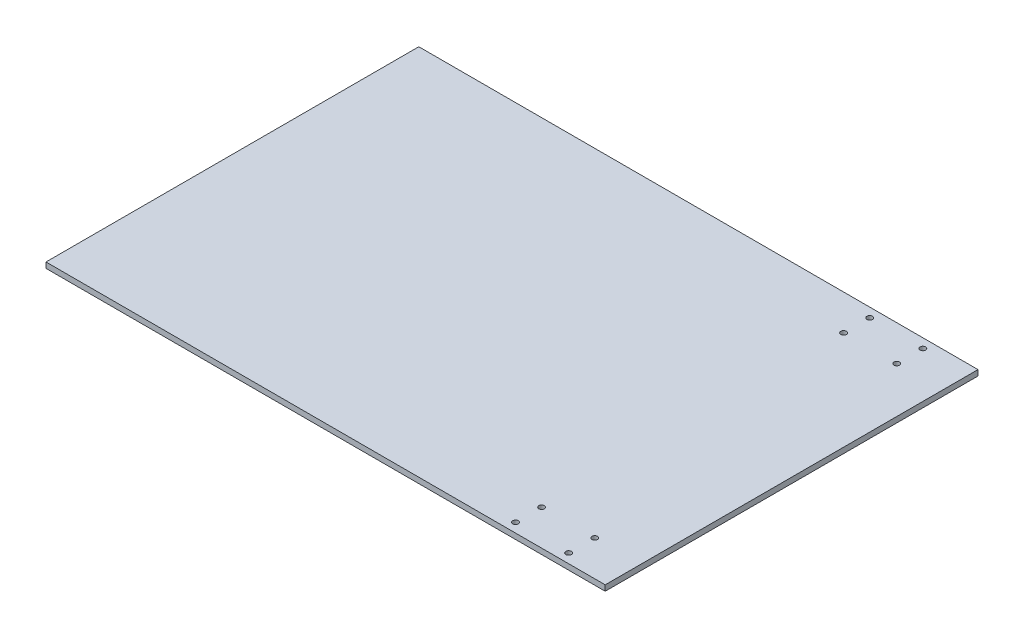
ISO-10303-21;
HEADER;
FILE_DESCRIPTION(('STEP AP214'),'2;1');
FILE_NAME('part.step','',(''),(''),'','','');
FILE_SCHEMA(('AUTOMOTIVE_DESIGN { 1 0 10303 214 1 1 1 1 }'));
ENDSEC;
DATA;
#1=APPLICATION_CONTEXT('core data for automotive mechanical design processes');
#2=APPLICATION_PROTOCOL_DEFINITION('international standard','automotive_design',2000,#1);
#3=PRODUCT_CONTEXT('',#1,'mechanical');
#4=PRODUCT('Part','Part','',(#3));
#5=PRODUCT_RELATED_PRODUCT_CATEGORY('part','',(#4));
#6=PRODUCT_DEFINITION_FORMATION('','',#4);
#7=PRODUCT_DEFINITION_CONTEXT('part definition',#1,'design');
#8=PRODUCT_DEFINITION('design','',#6,#7);
#9=PRODUCT_DEFINITION_SHAPE('','',#8);
#10=(LENGTH_UNIT() NAMED_UNIT(*) SI_UNIT(.MILLI.,.METRE.));
#11=(NAMED_UNIT(*) PLANE_ANGLE_UNIT() SI_UNIT($,.RADIAN.));
#12=(NAMED_UNIT(*) SI_UNIT($,.STERADIAN.) SOLID_ANGLE_UNIT());
#13=UNCERTAINTY_MEASURE_WITH_UNIT(LENGTH_MEASURE(1.E-05),#10,'distance_accuracy_value','');
#14=(GEOMETRIC_REPRESENTATION_CONTEXT(3) GLOBAL_UNCERTAINTY_ASSIGNED_CONTEXT((#13)) GLOBAL_UNIT_ASSIGNED_CONTEXT((#10,
#11,#12)) REPRESENTATION_CONTEXT('',''));
#15=CARTESIAN_POINT('',(0.,0.,0.));
#16=DIRECTION('',(0.,0.,1.));
#17=DIRECTION('',(1.,0.,0.));
#18=AXIS2_PLACEMENT_3D('',#15,#16,#17);
#19=CARTESIAN_POINT('',(0.,3.,0.));
#20=DIRECTION('',(1.,0.,0.));
#21=DIRECTION('',(0.,0.,-1.));
#22=AXIS2_PLACEMENT_3D('',#19,#20,#21);
#23=PLANE('',#22);
#24=DIRECTION('',(0.,0.,1.));
#25=VECTOR('',#24,1.);
#26=CARTESIAN_POINT('',(0.,0.,0.));
#27=LINE('',#26,#25);
#28=CARTESIAN_POINT('',(0.,0.,-200.));
#29=VERTEX_POINT('',#28);
#30=CARTESIAN_POINT('',(0.,0.,0.));
#31=VERTEX_POINT('',#30);
#32=EDGE_CURVE('E106',#29,#31,#27,.T.);
#33=ORIENTED_EDGE('',*,*,#32,.T.);
#34=DIRECTION('',(0.,-1.,0.));
#35=VECTOR('',#34,1.);
#36=CARTESIAN_POINT('',(0.,3.,0.));
#37=LINE('',#36,#35);
#38=CARTESIAN_POINT('',(0.,3.,0.));
#39=VERTEX_POINT('',#38);
#40=EDGE_CURVE('E11',#39,#31,#37,.T.);
#41=ORIENTED_EDGE('',*,*,#40,.F.);
#42=DIRECTION('',(0.,0.,1.));
#43=VECTOR('',#42,1.);
#44=CARTESIAN_POINT('',(0.,3.,0.));
#45=LINE('',#44,#43);
#46=CARTESIAN_POINT('',(0.,3.,-200.));
#47=VERTEX_POINT('',#46);
#48=EDGE_CURVE('E90',#47,#39,#45,.T.);
#49=ORIENTED_EDGE('',*,*,#48,.F.);
#50=DIRECTION('',(0.,-1.,0.));
#51=VECTOR('',#50,1.);
#52=CARTESIAN_POINT('',(0.,3.,-200.));
#53=LINE('',#52,#51);
#54=EDGE_CURVE('E102',#47,#29,#53,.T.);
#55=ORIENTED_EDGE('',*,*,#54,.T.);
#56=EDGE_LOOP('',(#33,#41,#49,#55));
#57=FACE_BOUND('',#56,.T.);
#58=ADVANCED_FACE('F38',(#57),#23,.F.);
#59=CARTESIAN_POINT('',(0.,3.,0.));
#60=DIRECTION('',(0.,0.,-1.));
#61=DIRECTION('',(-1.,0.,0.));
#62=AXIS2_PLACEMENT_3D('',#59,#60,#61);
#63=PLANE('',#62);
#64=DIRECTION('',(1.,0.,0.));
#65=VECTOR('',#64,1.);
#66=CARTESIAN_POINT('',(0.,0.,0.));
#67=LINE('',#66,#65);
#68=CARTESIAN_POINT('',(300.,0.,0.));
#69=VERTEX_POINT('',#68);
#70=EDGE_CURVE('E95',#31,#69,#67,.T.);
#71=ORIENTED_EDGE('',*,*,#70,.T.);
#72=DIRECTION('',(0.,-1.,0.));
#73=VECTOR('',#72,1.);
#74=CARTESIAN_POINT('',(300.,3.,0.));
#75=LINE('',#74,#73);
#76=CARTESIAN_POINT('',(300.,3.,0.));
#77=VERTEX_POINT('',#76);
#78=EDGE_CURVE('E47',#77,#69,#75,.T.);
#79=ORIENTED_EDGE('',*,*,#78,.F.);
#80=DIRECTION('',(1.,0.,0.));
#81=VECTOR('',#80,1.);
#82=CARTESIAN_POINT('',(0.,3.,0.));
#83=LINE('',#82,#81);
#84=EDGE_CURVE('E85',#39,#77,#83,.T.);
#85=ORIENTED_EDGE('',*,*,#84,.F.);
#86=ORIENTED_EDGE('',*,*,#40,.T.);
#87=EDGE_LOOP('',(#71,#79,#85,#86));
#88=FACE_BOUND('',#87,.T.);
#89=ADVANCED_FACE('F94',(#88),#63,.F.);
#90=CARTESIAN_POINT('',(300.,3.,0.));
#91=DIRECTION('',(-1.,0.,0.));
#92=DIRECTION('',(0.,0.,1.));
#93=AXIS2_PLACEMENT_3D('',#90,#91,#92);
#94=PLANE('',#93);
#95=DIRECTION('',(0.,0.,-1.));
#96=VECTOR('',#95,1.);
#97=CARTESIAN_POINT('',(300.,0.,0.));
#98=LINE('',#97,#96);
#99=CARTESIAN_POINT('',(300.,0.,-200.));
#100=VERTEX_POINT('',#99);
#101=EDGE_CURVE('E72',#69,#100,#98,.T.);
#102=ORIENTED_EDGE('',*,*,#101,.T.);
#103=DIRECTION('',(0.,-1.,0.));
#104=VECTOR('',#103,1.);
#105=CARTESIAN_POINT('',(300.,3.,-200.));
#106=LINE('',#105,#104);
#107=CARTESIAN_POINT('',(300.,3.,-200.));
#108=VERTEX_POINT('',#107);
#109=EDGE_CURVE('E97',#108,#100,#106,.T.);
#110=ORIENTED_EDGE('',*,*,#109,.F.);
#111=DIRECTION('',(0.,0.,-1.));
#112=VECTOR('',#111,1.);
#113=CARTESIAN_POINT('',(300.,3.,0.));
#114=LINE('',#113,#112);
#115=EDGE_CURVE('E88',#77,#108,#114,.T.);
#116=ORIENTED_EDGE('',*,*,#115,.F.);
#117=ORIENTED_EDGE('',*,*,#78,.T.);
#118=EDGE_LOOP('',(#102,#110,#116,#117));
#119=FACE_BOUND('',#118,.T.);
#120=ADVANCED_FACE('F98',(#119),#94,.F.);
#121=CARTESIAN_POINT('',(0.,3.,-200.));
#122=DIRECTION('',(0.,0.,1.));
#123=DIRECTION('',(1.,0.,0.));
#124=AXIS2_PLACEMENT_3D('',#121,#122,#123);
#125=PLANE('',#124);
#126=DIRECTION('',(-1.,0.,0.));
#127=VECTOR('',#126,1.);
#128=CARTESIAN_POINT('',(0.,0.,-200.));
#129=LINE('',#128,#127);
#130=EDGE_CURVE('E78',#100,#29,#129,.T.);
#131=ORIENTED_EDGE('',*,*,#130,.T.);
#132=ORIENTED_EDGE('',*,*,#54,.F.);
#133=DIRECTION('',(-1.,0.,0.));
#134=VECTOR('',#133,1.);
#135=CARTESIAN_POINT('',(0.,3.,-200.));
#136=LINE('',#135,#134);
#137=EDGE_CURVE('E55',#108,#47,#136,.T.);
#138=ORIENTED_EDGE('',*,*,#137,.F.);
#139=ORIENTED_EDGE('',*,*,#109,.T.);
#140=EDGE_LOOP('',(#131,#132,#138,#139));
#141=FACE_BOUND('',#140,.T.);
#142=ADVANCED_FACE('F120',(#141),#125,.F.);
#143=CARTESIAN_POINT('',(0.,3.,0.));
#144=DIRECTION('',(0.,-1.,0.));
#145=DIRECTION('',(0.,0.,-1.));
#146=AXIS2_PLACEMENT_3D('',#143,#144,#145);
#147=PLANE('',#146);
#148=CARTESIAN_POINT('',(275.4,3.,-19.));
#149=DIRECTION('',(0.,1.,0.));
#150=DIRECTION('',(0.,0.,-1.));
#151=AXIS2_PLACEMENT_3D('',#148,#149,#150);
#152=CIRCLE('',#151,1.50000000000002);
#153=CARTESIAN_POINT('',(275.4,3.,-20.5));
#154=VERTEX_POINT('',#153);
#155=EDGE_CURVE('E151',#154,#154,#152,.T.);
#156=ORIENTED_EDGE('',*,*,#155,.F.);
#157=EDGE_LOOP('',(#156));
#158=FACE_BOUND('',#157,.T.);
#159=CARTESIAN_POINT('',(275.4,3.,-195.));
#160=DIRECTION('',(0.,1.,0.));
#161=DIRECTION('',(0.,0.,-1.));
#162=AXIS2_PLACEMENT_3D('',#159,#160,#161);
#163=CIRCLE('',#162,1.50000000000002);
#164=CARTESIAN_POINT('',(275.4,3.,-196.5));
#165=VERTEX_POINT('',#164);
#166=EDGE_CURVE('E160',#165,#165,#163,.T.);
#167=ORIENTED_EDGE('',*,*,#166,.F.);
#168=EDGE_LOOP('',(#167));
#169=FACE_BOUND('',#168,.T.);
#170=CARTESIAN_POINT('',(246.9,3.,-181.));
#171=DIRECTION('',(0.,1.,0.));
#172=DIRECTION('',(0.,0.,1.));
#173=AXIS2_PLACEMENT_3D('',#170,#171,#172);
#174=CIRCLE('',#173,1.50000000000002);
#175=CARTESIAN_POINT('',(246.9,3.,-179.5));
#176=VERTEX_POINT('',#175);
#177=EDGE_CURVE('E135',#176,#176,#174,.T.);
#178=ORIENTED_EDGE('',*,*,#177,.F.);
#179=EDGE_LOOP('',(#178));
#180=FACE_BOUND('',#179,.T.);
#181=CARTESIAN_POINT('',(275.4,3.,-181.));
#182=DIRECTION('',(0.,1.,0.));
#183=DIRECTION('',(0.,0.,1.));
#184=AXIS2_PLACEMENT_3D('',#181,#182,#183);
#185=CIRCLE('',#184,1.50000000000002);
#186=CARTESIAN_POINT('',(275.4,3.,-179.5));
#187=VERTEX_POINT('',#186);
#188=EDGE_CURVE('E144',#187,#187,#185,.T.);
#189=ORIENTED_EDGE('',*,*,#188,.F.);
#190=EDGE_LOOP('',(#189));
#191=FACE_BOUND('',#190,.T.);
#192=CARTESIAN_POINT('',(275.4,3.,-5.));
#193=DIRECTION('',(0.,1.,0.));
#194=DIRECTION('',(0.,0.,1.));
#195=AXIS2_PLACEMENT_3D('',#192,#193,#194);
#196=CIRCLE('',#195,1.50000000000002);
#197=CARTESIAN_POINT('',(275.4,3.,-3.49999999999998));
#198=VERTEX_POINT('',#197);
#199=EDGE_CURVE('E183',#198,#198,#196,.T.);
#200=ORIENTED_EDGE('',*,*,#199,.F.);
#201=EDGE_LOOP('',(#200));
#202=FACE_BOUND('',#201,.T.);
#203=CARTESIAN_POINT('',(246.9,3.,-5.));
#204=DIRECTION('',(0.,1.,0.));
#205=DIRECTION('',(0.,0.,-1.));
#206=AXIS2_PLACEMENT_3D('',#203,#204,#205);
#207=CIRCLE('',#206,1.50000000000002);
#208=CARTESIAN_POINT('',(246.9,3.,-6.50000000000003));
#209=VERTEX_POINT('',#208);
#210=EDGE_CURVE('E175',#209,#209,#207,.T.);
#211=ORIENTED_EDGE('',*,*,#210,.F.);
#212=EDGE_LOOP('',(#211));
#213=FACE_BOUND('',#212,.T.);
#214=CARTESIAN_POINT('',(246.9,3.,-19.));
#215=DIRECTION('',(0.,1.,0.));
#216=DIRECTION('',(0.,0.,-1.));
#217=AXIS2_PLACEMENT_3D('',#214,#215,#216);
#218=CIRCLE('',#217,1.50000000000002);
#219=CARTESIAN_POINT('',(246.9,3.,-20.5));
#220=VERTEX_POINT('',#219);
#221=EDGE_CURVE('E167',#220,#220,#218,.T.);
#222=ORIENTED_EDGE('',*,*,#221,.F.);
#223=EDGE_LOOP('',(#222));
#224=FACE_BOUND('',#223,.T.);
#225=CARTESIAN_POINT('',(246.9,3.,-195.));
#226=DIRECTION('',(0.,1.,0.));
#227=DIRECTION('',(0.,0.,1.));
#228=AXIS2_PLACEMENT_3D('',#225,#226,#227);
#229=CIRCLE('',#228,1.50000000000002);
#230=CARTESIAN_POINT('',(246.9,3.,-193.5));
#231=VERTEX_POINT('',#230);
#232=EDGE_CURVE('E127',#231,#231,#229,.T.);
#233=ORIENTED_EDGE('',*,*,#232,.F.);
#234=EDGE_LOOP('',(#233));
#235=FACE_BOUND('',#234,.T.);
#236=ORIENTED_EDGE('',*,*,#48,.T.);
#237=ORIENTED_EDGE('',*,*,#84,.T.);
#238=ORIENTED_EDGE('',*,*,#115,.T.);
#239=ORIENTED_EDGE('',*,*,#137,.T.);
#240=EDGE_LOOP('',(#236,#237,#238,#239));
#241=FACE_BOUND('',#240,.T.);
#242=ADVANCED_FACE('F86',(#158,#169,#180,#191,#202,#213,#224,#235,#241),#147,.F.);
#243=CARTESIAN_POINT('',(0.,0.,0.));
#244=DIRECTION('',(0.,-1.,0.));
#245=DIRECTION('',(0.,0.,-1.));
#246=AXIS2_PLACEMENT_3D('',#243,#244,#245);
#247=PLANE('',#246);
#248=CARTESIAN_POINT('',(275.4,0.,-19.));
#249=DIRECTION('',(0.,1.,0.));
#250=DIRECTION('',(0.,0.,-1.));
#251=AXIS2_PLACEMENT_3D('',#248,#249,#250);
#252=CIRCLE('',#251,1.50000000000002);
#253=CARTESIAN_POINT('',(275.4,0.,-20.5));
#254=VERTEX_POINT('',#253);
#255=EDGE_CURVE('E155',#254,#254,#252,.T.);
#256=ORIENTED_EDGE('',*,*,#255,.T.);
#257=EDGE_LOOP('',(#256));
#258=FACE_BOUND('',#257,.T.);
#259=CARTESIAN_POINT('',(275.4,0.,-195.));
#260=DIRECTION('',(0.,1.,0.));
#261=DIRECTION('',(0.,0.,-1.));
#262=AXIS2_PLACEMENT_3D('',#259,#260,#261);
#263=CIRCLE('',#262,1.50000000000002);
#264=CARTESIAN_POINT('',(275.4,0.,-196.5));
#265=VERTEX_POINT('',#264);
#266=EDGE_CURVE('E140',#265,#265,#263,.T.);
#267=ORIENTED_EDGE('',*,*,#266,.T.);
#268=EDGE_LOOP('',(#267));
#269=FACE_BOUND('',#268,.T.);
#270=CARTESIAN_POINT('',(246.9,0.,-181.));
#271=DIRECTION('',(0.,1.,0.));
#272=DIRECTION('',(0.,0.,1.));
#273=AXIS2_PLACEMENT_3D('',#270,#271,#272);
#274=CIRCLE('',#273,1.50000000000002);
#275=CARTESIAN_POINT('',(246.9,0.,-179.5));
#276=VERTEX_POINT('',#275);
#277=EDGE_CURVE('E139',#276,#276,#274,.T.);
#278=ORIENTED_EDGE('',*,*,#277,.T.);
#279=EDGE_LOOP('',(#278));
#280=FACE_BOUND('',#279,.T.);
#281=CARTESIAN_POINT('',(275.4,0.,-181.));
#282=DIRECTION('',(0.,1.,0.));
#283=DIRECTION('',(0.,0.,1.));
#284=AXIS2_PLACEMENT_3D('',#281,#282,#283);
#285=CIRCLE('',#284,1.50000000000002);
#286=CARTESIAN_POINT('',(275.4,0.,-179.5));
#287=VERTEX_POINT('',#286);
#288=EDGE_CURVE('E131',#287,#287,#285,.T.);
#289=ORIENTED_EDGE('',*,*,#288,.T.);
#290=EDGE_LOOP('',(#289));
#291=FACE_BOUND('',#290,.T.);
#292=CARTESIAN_POINT('',(275.4,0.,-5.));
#293=DIRECTION('',(0.,1.,0.));
#294=DIRECTION('',(0.,0.,1.));
#295=AXIS2_PLACEMENT_3D('',#292,#293,#294);
#296=CIRCLE('',#295,1.50000000000002);
#297=CARTESIAN_POINT('',(275.4,0.,-3.49999999999998));
#298=VERTEX_POINT('',#297);
#299=EDGE_CURVE('E156',#298,#298,#296,.T.);
#300=ORIENTED_EDGE('',*,*,#299,.T.);
#301=EDGE_LOOP('',(#300));
#302=FACE_BOUND('',#301,.T.);
#303=CARTESIAN_POINT('',(246.9,0.,-5.));
#304=DIRECTION('',(0.,1.,0.));
#305=DIRECTION('',(0.,0.,-1.));
#306=AXIS2_PLACEMENT_3D('',#303,#304,#305);
#307=CIRCLE('',#306,1.50000000000002);
#308=CARTESIAN_POINT('',(246.9,0.,-6.50000000000003));
#309=VERTEX_POINT('',#308);
#310=EDGE_CURVE('E179',#309,#309,#307,.T.);
#311=ORIENTED_EDGE('',*,*,#310,.T.);
#312=EDGE_LOOP('',(#311));
#313=FACE_BOUND('',#312,.T.);
#314=CARTESIAN_POINT('',(246.9,0.,-19.));
#315=DIRECTION('',(0.,1.,0.));
#316=DIRECTION('',(0.,0.,-1.));
#317=AXIS2_PLACEMENT_3D('',#314,#315,#316);
#318=CIRCLE('',#317,1.50000000000002);
#319=CARTESIAN_POINT('',(246.9,0.,-20.5));
#320=VERTEX_POINT('',#319);
#321=EDGE_CURVE('E171',#320,#320,#318,.T.);
#322=ORIENTED_EDGE('',*,*,#321,.T.);
#323=EDGE_LOOP('',(#322));
#324=FACE_BOUND('',#323,.T.);
#325=CARTESIAN_POINT('',(246.9,0.,-195.));
#326=DIRECTION('',(0.,1.,0.));
#327=DIRECTION('',(0.,0.,1.));
#328=AXIS2_PLACEMENT_3D('',#325,#326,#327);
#329=CIRCLE('',#328,1.50000000000002);
#330=CARTESIAN_POINT('',(246.9,0.,-193.5));
#331=VERTEX_POINT('',#330);
#332=EDGE_CURVE('E110',#331,#331,#329,.T.);
#333=ORIENTED_EDGE('',*,*,#332,.T.);
#334=EDGE_LOOP('',(#333));
#335=FACE_BOUND('',#334,.T.);
#336=ORIENTED_EDGE('',*,*,#32,.F.);
#337=ORIENTED_EDGE('',*,*,#130,.F.);
#338=ORIENTED_EDGE('',*,*,#101,.F.);
#339=ORIENTED_EDGE('',*,*,#70,.F.);
#340=EDGE_LOOP('',(#336,#337,#338,#339));
#341=FACE_BOUND('',#340,.T.);
#342=ADVANCED_FACE('F123',(#258,#269,#280,#291,#302,#313,#324,#335,#341),#247,.T.);
#343=CARTESIAN_POINT('',(246.9,0.,-195.));
#344=DIRECTION('',(0.,1.,0.));
#345=DIRECTION('',(0.,0.,1.));
#346=AXIS2_PLACEMENT_3D('',#343,#344,#345);
#347=CYLINDRICAL_SURFACE('',#346,1.50000000000002);
#348=ORIENTED_EDGE('',*,*,#332,.F.);
#349=EDGE_LOOP('',(#348));
#350=FACE_BOUND('',#349,.T.);
#351=ORIENTED_EDGE('',*,*,#232,.T.);
#352=EDGE_LOOP('',(#351));
#353=FACE_BOUND('',#352,.T.);
#354=ADVANCED_FACE('F211',(#350,#353),#347,.F.);
#355=CARTESIAN_POINT('',(246.9,0.,-19.));
#356=DIRECTION('',(0.,1.,0.));
#357=DIRECTION('',(0.,0.,1.));
#358=AXIS2_PLACEMENT_3D('',#355,#356,#357);
#359=CYLINDRICAL_SURFACE('',#358,1.50000000000002);
#360=ORIENTED_EDGE('',*,*,#321,.F.);
#361=EDGE_LOOP('',(#360));
#362=FACE_BOUND('',#361,.T.);
#363=ORIENTED_EDGE('',*,*,#221,.T.);
#364=EDGE_LOOP('',(#363));
#365=FACE_BOUND('',#364,.T.);
#366=ADVANCED_FACE('F213',(#362,#365),#359,.F.);
#367=CARTESIAN_POINT('',(246.9,0.,-5.));
#368=DIRECTION('',(0.,1.,0.));
#369=DIRECTION('',(0.,0.,1.));
#370=AXIS2_PLACEMENT_3D('',#367,#368,#369);
#371=CYLINDRICAL_SURFACE('',#370,1.50000000000002);
#372=ORIENTED_EDGE('',*,*,#310,.F.);
#373=EDGE_LOOP('',(#372));
#374=FACE_BOUND('',#373,.T.);
#375=ORIENTED_EDGE('',*,*,#210,.T.);
#376=EDGE_LOOP('',(#375));
#377=FACE_BOUND('',#376,.T.);
#378=ADVANCED_FACE('F197',(#374,#377),#371,.F.);
#379=CARTESIAN_POINT('',(275.4,0.,-5.));
#380=DIRECTION('',(0.,1.,0.));
#381=DIRECTION('',(0.,0.,1.));
#382=AXIS2_PLACEMENT_3D('',#379,#380,#381);
#383=CYLINDRICAL_SURFACE('',#382,1.50000000000002);
#384=ORIENTED_EDGE('',*,*,#299,.F.);
#385=EDGE_LOOP('',(#384));
#386=FACE_BOUND('',#385,.T.);
#387=ORIENTED_EDGE('',*,*,#199,.T.);
#388=EDGE_LOOP('',(#387));
#389=FACE_BOUND('',#388,.T.);
#390=ADVANCED_FACE('F193',(#386,#389),#383,.F.);
#391=CARTESIAN_POINT('',(275.4,0.,-181.));
#392=DIRECTION('',(0.,1.,0.));
#393=DIRECTION('',(0.,0.,1.));
#394=AXIS2_PLACEMENT_3D('',#391,#392,#393);
#395=CYLINDRICAL_SURFACE('',#394,1.50000000000002);
#396=ORIENTED_EDGE('',*,*,#288,.F.);
#397=EDGE_LOOP('',(#396));
#398=FACE_BOUND('',#397,.T.);
#399=ORIENTED_EDGE('',*,*,#188,.T.);
#400=EDGE_LOOP('',(#399));
#401=FACE_BOUND('',#400,.T.);
#402=ADVANCED_FACE('F196',(#398,#401),#395,.F.);
#403=CARTESIAN_POINT('',(246.9,0.,-181.));
#404=DIRECTION('',(0.,1.,0.));
#405=DIRECTION('',(0.,0.,1.));
#406=AXIS2_PLACEMENT_3D('',#403,#404,#405);
#407=CYLINDRICAL_SURFACE('',#406,1.50000000000002);
#408=ORIENTED_EDGE('',*,*,#277,.F.);
#409=EDGE_LOOP('',(#408));
#410=FACE_BOUND('',#409,.T.);
#411=ORIENTED_EDGE('',*,*,#177,.T.);
#412=EDGE_LOOP('',(#411));
#413=FACE_BOUND('',#412,.T.);
#414=ADVANCED_FACE('F284',(#410,#413),#407,.F.);
#415=CARTESIAN_POINT('',(275.4,0.,-195.));
#416=DIRECTION('',(0.,1.,0.));
#417=DIRECTION('',(0.,0.,1.));
#418=AXIS2_PLACEMENT_3D('',#415,#416,#417);
#419=CYLINDRICAL_SURFACE('',#418,1.50000000000002);
#420=ORIENTED_EDGE('',*,*,#266,.F.);
#421=EDGE_LOOP('',(#420));
#422=FACE_BOUND('',#421,.T.);
#423=ORIENTED_EDGE('',*,*,#166,.T.);
#424=EDGE_LOOP('',(#423));
#425=FACE_BOUND('',#424,.T.);
#426=ADVANCED_FACE('F294',(#422,#425),#419,.F.);
#427=CARTESIAN_POINT('',(275.4,0.,-19.));
#428=DIRECTION('',(0.,1.,0.));
#429=DIRECTION('',(0.,0.,1.));
#430=AXIS2_PLACEMENT_3D('',#427,#428,#429);
#431=CYLINDRICAL_SURFACE('',#430,1.50000000000002);
#432=ORIENTED_EDGE('',*,*,#255,.F.);
#433=EDGE_LOOP('',(#432));
#434=FACE_BOUND('',#433,.T.);
#435=ORIENTED_EDGE('',*,*,#155,.T.);
#436=EDGE_LOOP('',(#435));
#437=FACE_BOUND('',#436,.T.);
#438=ADVANCED_FACE('F303',(#434,#437),#431,.F.);
#439=CLOSED_SHELL('',(#58,#89,#120,#142,#242,#342,#354,#366,#378,#390,#402,#414,#426,#438));
#440=MANIFOLD_SOLID_BREP('B2',#439);
#441=ADVANCED_BREP_SHAPE_REPRESENTATION('',(#18,#440),#14);
#442=SHAPE_DEFINITION_REPRESENTATION(#9,#441);
ENDSEC;
END-ISO-10303-21;
